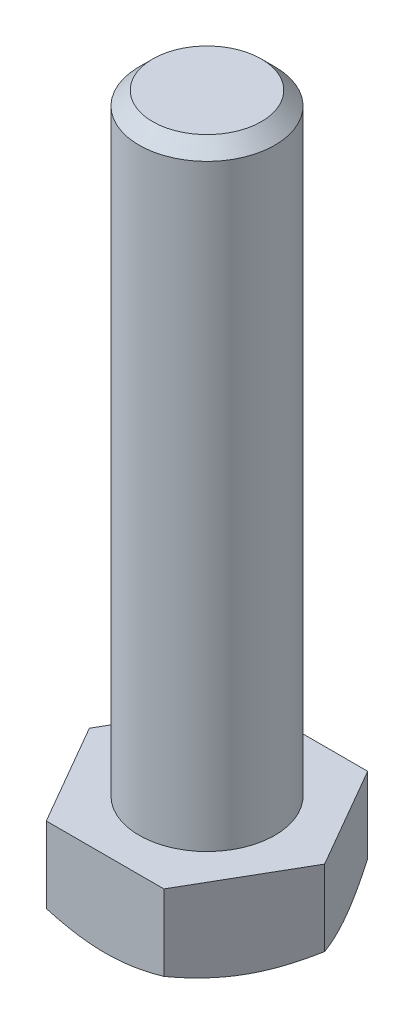
ISO-10303-21;
HEADER;
FILE_DESCRIPTION(('STEP AP214'),'2;1');
FILE_NAME('part.step','',(''),(''),'','','');
FILE_SCHEMA(('AUTOMOTIVE_DESIGN { 1 0 10303 214 1 1 1 1 }'));
ENDSEC;
DATA;
#1=APPLICATION_CONTEXT('core data for automotive mechanical design processes');
#2=APPLICATION_PROTOCOL_DEFINITION('international standard','automotive_design',2000,#1);
#3=PRODUCT_CONTEXT('',#1,'mechanical');
#4=PRODUCT('Part','Part','',(#3));
#5=PRODUCT_RELATED_PRODUCT_CATEGORY('part','',(#4));
#6=PRODUCT_DEFINITION_FORMATION('','',#4);
#7=PRODUCT_DEFINITION_CONTEXT('part definition',#1,'design');
#8=PRODUCT_DEFINITION('design','',#6,#7);
#9=PRODUCT_DEFINITION_SHAPE('','',#8);
#10=(LENGTH_UNIT() NAMED_UNIT(*) SI_UNIT(.MILLI.,.METRE.));
#11=(NAMED_UNIT(*) PLANE_ANGLE_UNIT() SI_UNIT($,.RADIAN.));
#12=(NAMED_UNIT(*) SI_UNIT($,.STERADIAN.) SOLID_ANGLE_UNIT());
#13=UNCERTAINTY_MEASURE_WITH_UNIT(LENGTH_MEASURE(1.E-05),#10,'distance_accuracy_value','');
#14=(GEOMETRIC_REPRESENTATION_CONTEXT(3) GLOBAL_UNCERTAINTY_ASSIGNED_CONTEXT((#13)) GLOBAL_UNIT_ASSIGNED_CONTEXT((#10,
#11,#12)) REPRESENTATION_CONTEXT('',''));
#15=CARTESIAN_POINT('',(0.,0.,0.));
#16=DIRECTION('',(0.,0.,1.));
#17=DIRECTION('',(1.,0.,0.));
#18=AXIS2_PLACEMENT_3D('',#15,#16,#17);
#19=CARTESIAN_POINT('',(-8.66025403784437,12.5,15.));
#20=DIRECTION('',(0.,0.,-1.));
#21=DIRECTION('',(-1.,0.,0.));
#22=AXIS2_PLACEMENT_3D('',#19,#20,#21);
#23=PLANE('',#22);
#24=CARTESIAN_POINT('',(-22.9682699623457,7.17790057965226,15.));
#25=CARTESIAN_POINT('',(-22.6389897831074,7.01873142404232,15.));
#26=CARTESIAN_POINT('',(-22.3093116021534,6.86038603901537,15.));
#27=CARTESIAN_POINT('',(-21.6490751536496,6.54553189598666,15.));
#28=CARTESIAN_POINT('',(-21.3185168764806,6.38902315816101,15.));
#29=CARTESIAN_POINT('',(-20.3252989549744,5.92249019185913,15.));
#30=CARTESIAN_POINT('',(-19.6612032697286,5.6155111060719,15.));
#31=CARTESIAN_POINT('',(-18.3246226043912,5.00989859467258,15.));
#32=CARTESIAN_POINT('',(-17.6521113636296,4.71132298088697,15.));
#33=CARTESIAN_POINT('',(-16.3015621477646,4.12699119584707,15.));
#34=CARTESIAN_POINT('',(-15.6235244629268,3.84123435637443,15.));
#35=CARTESIAN_POINT('',(-14.2524269634776,3.28256457383085,15.));
#36=CARTESIAN_POINT('',(-13.5592849190571,3.00985238384249,15.));
#37=CARTESIAN_POINT('',(-12.1648203164479,2.48578579805704,15.));
#38=CARTESIAN_POINT('',(-11.4634968579634,2.23443377846729,15.));
#39=CARTESIAN_POINT('',(-10.0530172161698,1.75984469264095,15.));
#40=CARTESIAN_POINT('',(-9.34388131081083,1.53654785403614,15.));
#41=CARTESIAN_POINT('',(-7.91545988349898,1.12531011422904,15.));
#42=CARTESIAN_POINT('',(-7.19617764885276,0.937358032225478,15.));
#43=CARTESIAN_POINT('',(-6.10950776052101,0.688818819828081,15.));
#44=CARTESIAN_POINT('',(-5.74591626101912,0.611524520059375,15.));
#45=CARTESIAN_POINT('',(-5.01631310495841,0.469286024803715,15.));
#46=CARTESIAN_POINT('',(-4.6503015012506,0.404341560532863,15.));
#47=CARTESIAN_POINT('',(-3.91609659669045,0.28795299776045,15.));
#48=CARTESIAN_POINT('',(-3.54790312013279,0.236510002059412,15.));
#49=CARTESIAN_POINT('',(-2.80977894214554,0.148161213469121,15.));
#50=CARTESIAN_POINT('',(-2.43984831081847,0.111254838973182,15.));
#51=CARTESIAN_POINT('',(-1.70111543119012,0.052969235151156,15.));
#52=CARTESIAN_POINT('',(-1.33232087528458,0.0314931455080723,15.));
#53=CARTESIAN_POINT('',(-0.594154033471562,0.00418216853330275,15.));
#54=CARTESIAN_POINT('',(-0.224781755128965,-0.00165292191907885,15.));
#55=CARTESIAN_POINT('',(0.513772761739808,0.0024565342659176,15.));
#56=CARTESIAN_POINT('',(0.882955024506809,0.0123966523921795,15.));
#57=CARTESIAN_POINT('',(1.62057875039964,0.0478095011464207,15.));
#58=CARTESIAN_POINT('',(1.98902017560895,0.0732830074530997,15.));
#59=CARTESIAN_POINT('',(2.88200878597982,0.153315988744048,15.));
#60=CARTESIAN_POINT('',(3.40586988037198,0.2156582294693,15.));
#61=CARTESIAN_POINT('',(4.44957771463115,0.368284321561829,15.));
#62=CARTESIAN_POINT('',(4.96942331940067,0.458575797224107,15.));
#63=CARTESIAN_POINT('',(6.00467140043033,0.663898119259721,15.));
#64=CARTESIAN_POINT('',(6.52006919294576,0.778952357645818,15.));
#65=CARTESIAN_POINT('',(7.54556200724787,1.03028935659401,15.));
#66=CARTESIAN_POINT('',(8.05565752365372,1.16657011774881,15.));
#67=CARTESIAN_POINT('',(9.08310964327576,1.46066370490329,15.));
#68=CARTESIAN_POINT('',(9.60033774272846,1.6189224444397,15.));
#69=CARTESIAN_POINT('',(10.6293258234342,1.95107200986665,15.));
#70=CARTESIAN_POINT('',(11.1410893076101,2.12495205365792,15.));
#71=CARTESIAN_POINT('',(12.1570993841288,2.48477464183466,15.));
#72=CARTESIAN_POINT('',(12.6613720729254,2.67064378150478,15.));
#73=CARTESIAN_POINT('',(13.4147912594166,2.95756327132976,15.));
#74=CARTESIAN_POINT('',(13.6654863245841,3.05457748949894,15.));
#75=CARTESIAN_POINT('',(14.1659013187592,3.25107322933562,15.));
#76=CARTESIAN_POINT('',(14.4156212703266,3.35055469352573,15.));
#77=CARTESIAN_POINT('',(14.6648887120004,3.45115877453162,15.));
#78=B_SPLINE_CURVE_WITH_KNOTS('',3,(#24,#25,#26,#27,#28,#29,#30,#31,#32,#33,#34,#35,#36,#37,#38,
#39,#40,#41,#42,#43,#44,#45,#46,#47,#48,#49,#50,#51,#52,#53,#54,#55,#56,#57,#58,#59,#60,#61,#62,
#63,#64,#65,#66,#67,#68,#69,#70,#71,#72,#73,#74,#75,#76,#77),.UNSPECIFIED.,.F.,.F.,(4,2,2,2,2,2,
2,2,2,2,2,2,2,2,2,2,2,2,2,2,2,2,2,2,2,2,4),(0.,1.09719534304745,2.19440272785255,
4.38917437060372,6.59650580508102,8.80372204153741,11.0380360432621,13.2725982762572,
15.502315932016,17.7313270580364,18.8463006788363,19.9612500303848,21.0762904227212,
22.1912861980293,23.2992201789375,24.4071397716721,25.5147483975893,26.6224123378252,
28.2042036031028,29.7864267473646,31.3701511423085,32.9537264503146,34.5761185954281,
36.1973994161361,37.8095545791832,38.6159794277519,39.4223855073193),.UNSPECIFIED.);
#79=CARTESIAN_POINT('',(8.66025403784439,1.33974596215562,15.));
#80=VERTEX_POINT('',#79);
#81=CARTESIAN_POINT('',(0.,0.,15.));
#82=VERTEX_POINT('',#81);
#83=EDGE_CURVE('E236',#80,#82,#78,.F.);
#84=ORIENTED_EDGE('',*,*,#83,.F.);
#85=DIRECTION('',(0.,-1.,0.));
#86=VECTOR('',#85,1.);
#87=CARTESIAN_POINT('',(8.66025403784439,12.5,15.));
#88=LINE('',#87,#86);
#89=CARTESIAN_POINT('',(8.66025403784439,12.5,15.));
#90=VERTEX_POINT('',#89);
#91=EDGE_CURVE('E135',#90,#80,#88,.T.);
#92=ORIENTED_EDGE('',*,*,#91,.F.);
#93=DIRECTION('',(1.,0.,0.));
#94=VECTOR('',#93,1.);
#95=CARTESIAN_POINT('',(-8.66025403784437,12.5,15.));
#96=LINE('',#95,#94);
#97=CARTESIAN_POINT('',(-8.66025403784437,12.5,15.));
#98=VERTEX_POINT('',#97);
#99=EDGE_CURVE('E246',#98,#90,#96,.T.);
#100=ORIENTED_EDGE('',*,*,#99,.F.);
#101=DIRECTION('',(0.,-1.,0.));
#102=VECTOR('',#101,1.);
#103=CARTESIAN_POINT('',(-8.66025403784437,12.5,15.));
#104=LINE('',#103,#102);
#105=CARTESIAN_POINT('',(-8.66025403784439,1.33974596215562,15.));
#106=VERTEX_POINT('',#105);
#107=EDGE_CURVE('E261',#98,#106,#104,.T.);
#108=ORIENTED_EDGE('',*,*,#107,.T.);
#109=EDGE_CURVE('E200',#82,#106,#78,.F.);
#110=ORIENTED_EDGE('',*,*,#109,.F.);
#111=EDGE_LOOP('',(#84,#92,#100,#108,#110));
#112=FACE_BOUND('',#111,.T.);
#113=ADVANCED_FACE('F38',(#112),#23,.F.);
#114=CARTESIAN_POINT('',(8.66025403784439,12.5,15.));
#115=DIRECTION('',(-0.866025403784438,0.,-0.5));
#116=DIRECTION('',(-0.500000000000001,0.,0.866025403784439));
#117=AXIS2_PLACEMENT_3D('',#114,#115,#116);
#118=PLANE('',#117);
#119=CARTESIAN_POINT('',(17.3206235457426,1.33981262948895,-0.000200000000002282));
#120=CARTESIAN_POINT('',(17.130274565913,1.22992178974395,0.329494104233802));
#121=CARTESIAN_POINT('',(16.939183122782,1.12501758932862,0.660474192628304));
#122=CARTESIAN_POINT('',(16.5554679079492,0.926568581943116,1.32508844035602));
#123=CARTESIAN_POINT('',(16.3628436543362,0.833027511049506,1.65872343438381));
#124=CARTESIAN_POINT('',(15.9756905506624,0.658562147609872,2.32929228025473));
#125=CARTESIAN_POINT('',(15.7811583127512,0.577667706602199,2.66623200002702));
#126=CARTESIAN_POINT('',(15.3907420734253,0.430232643422054,3.34245276263939));
#127=CARTESIAN_POINT('',(15.1948581497855,0.363691202381336,3.68173367076952));
#128=CARTESIAN_POINT('',(14.8067578304067,0.247792374696317,4.35394314236733));
#129=CARTESIAN_POINT('',(14.6145702475688,0.198051383436675,4.68682180042635));
#130=CARTESIAN_POINT('',(14.2293144416656,0.114646749003616,5.35410443016171));
#131=CARTESIAN_POINT('',(14.0362462017216,0.0809834152900945,5.68850843107251));
#132=CARTESIAN_POINT('',(13.6497853945793,0.0305840757080928,6.35787818417717));
#133=CARTESIAN_POINT('',(13.4563934876199,0.0138279549580595,6.69284279280337));
#134=CARTESIAN_POINT('',(13.0694311550724,-0.00239660617301752,7.36308121339102));
#135=CARTESIAN_POINT('',(12.8758607351851,-0.00186558072758015,7.69835501547826));
#136=CARTESIAN_POINT('',(12.5139822792559,0.0152766129981689,8.32514688731221));
#137=CARTESIAN_POINT('',(12.3456484541475,0.0297968460490207,8.61670962503244));
#138=CARTESIAN_POINT('',(12.0093680110861,0.071637140422421,9.1991644380065));
#139=CARTESIAN_POINT('',(11.8414214213658,0.0989581071094842,9.4900564643599));
#140=CARTESIAN_POINT('',(11.5060066717823,0.165923511998912,10.0710118522466));
#141=CARTESIAN_POINT('',(11.338539022767,0.205578128270671,10.3610743289652));
#142=CARTESIAN_POINT('',(11.0043888432043,0.296515103017914,10.939839417326));
#143=CARTESIAN_POINT('',(10.8377063668174,0.347798251969268,11.2285419351595));
#144=CARTESIAN_POINT('',(10.3317324659531,0.520386864747118,12.1049144387604));
#145=CARTESIAN_POINT('',(9.99390625559026,0.658901178256943,12.6900465992373));
#146=CARTESIAN_POINT('',(9.32329122184511,0.973271968475227,13.8515859100034));
#147=CARTESIAN_POINT('',(8.99049381241396,1.14905461461789,14.4280079317654));
#148=CARTESIAN_POINT('',(8.66013856779054,1.33981262948895,15.0002));
#149=B_SPLINE_CURVE_WITH_KNOTS('',3,(#119,#120,#121,#122,#123,#124,#125,#126,#127,#128,#129,
#130,#131,#132,#133,#134,#135,#136,#137,#138,#139,#140,#141,#142,#143,#144,#145,#146,#147,#148),
.UNSPECIFIED.,.F.,.F.,(4,2,2,2,2,2,2,2,2,2,2,2,2,2,4),(0.,1.18875411504163,2.37789802800057,
3.56980778300395,4.76164951910136,5.92407379683759,7.08652044780813,8.24758247406079,
9.40860862348378,10.4193068498566,11.4300765712312,12.4416826308653,13.4533574773408,
15.5211962051185,17.5849760846241),.UNSPECIFIED.);
#150=CARTESIAN_POINT('',(17.3205080756888,1.33974596215562,0.));
#151=VERTEX_POINT('',#150);
#152=CARTESIAN_POINT('',(12.9903810567666,0.,7.5));
#153=VERTEX_POINT('',#152);
#154=EDGE_CURVE('E54',#151,#153,#149,.T.);
#155=ORIENTED_EDGE('',*,*,#154,.F.);
#156=DIRECTION('',(0.,-1.,0.));
#157=VECTOR('',#156,1.);
#158=CARTESIAN_POINT('',(17.3205080756888,12.4999999999999,0.));
#159=LINE('',#158,#157);
#160=CARTESIAN_POINT('',(17.3205080756888,12.4999999999999,0.));
#161=VERTEX_POINT('',#160);
#162=EDGE_CURVE('E132',#161,#151,#159,.T.);
#163=ORIENTED_EDGE('',*,*,#162,.F.);
#164=DIRECTION('',(0.5,0.,-0.866025403784438));
#165=VECTOR('',#164,1.);
#166=CARTESIAN_POINT('',(8.66025403784439,12.5,15.));
#167=LINE('',#166,#165);
#168=EDGE_CURVE('E242',#90,#161,#167,.T.);
#169=ORIENTED_EDGE('',*,*,#168,.F.);
#170=ORIENTED_EDGE('',*,*,#91,.T.);
#171=EDGE_CURVE('E211',#153,#80,#149,.T.);
#172=ORIENTED_EDGE('',*,*,#171,.F.);
#173=EDGE_LOOP('',(#155,#163,#169,#170,#172));
#174=FACE_BOUND('',#173,.T.);
#175=ADVANCED_FACE('F223',(#174),#118,.F.);
#176=CARTESIAN_POINT('',(17.3205080756888,12.4999999999999,0.));
#177=DIRECTION('',(-0.866025403784438,0.,0.5));
#178=DIRECTION('',(0.5,0.,0.866025403784438));
#179=AXIS2_PLACEMENT_3D('',#176,#177,#178);
#180=PLANE('',#179);
#181=CARTESIAN_POINT('',(8.66013856779054,1.33981262948888,-15.0002));
#182=CARTESIAN_POINT('',(8.85048754762015,1.22992178974392,-14.6705058957662));
#183=CARTESIAN_POINT('',(9.04157899075113,1.12501758932861,-14.3395258073717));
#184=CARTESIAN_POINT('',(9.42529420558398,0.926568581943117,-13.674911559644));
#185=CARTESIAN_POINT('',(9.617918459197,0.833027511049501,-13.3412765656162));
#186=CARTESIAN_POINT('',(10.0050715628708,0.658562147609863,-12.6707077197453));
#187=CARTESIAN_POINT('',(10.199603800782,0.577667706602192,-12.333767999973));
#188=CARTESIAN_POINT('',(10.5900200401078,0.430232643422048,-11.6575472373606));
#189=CARTESIAN_POINT('',(10.7859039637477,0.36369120238133,-11.3182663292305));
#190=CARTESIAN_POINT('',(11.1740042831265,0.247792374696312,-10.6460568576327));
#191=CARTESIAN_POINT('',(11.3661918659643,0.198051383436669,-10.3131781995737));
#192=CARTESIAN_POINT('',(11.7514476718676,0.114646749003609,-9.64589556983832));
#193=CARTESIAN_POINT('',(11.9445159118115,0.0809834152900877,-9.31149156892752));
#194=CARTESIAN_POINT('',(12.3309767189539,0.0305840757080838,-8.64212181582286));
#195=CARTESIAN_POINT('',(12.5243686259132,0.0138279549580488,-8.30715720719666));
#196=CARTESIAN_POINT('',(12.9113309584608,-0.00239660617302286,-7.63691878660901));
#197=CARTESIAN_POINT('',(13.104901378348,-0.00186558072757864,-7.30164498452176));
#198=CARTESIAN_POINT('',(13.4667798342773,0.0152766129981676,-6.6748531126878));
#199=CARTESIAN_POINT('',(13.6351136593857,0.0297968460490117,-6.38329037496758));
#200=CARTESIAN_POINT('',(13.9713941024471,0.0716371404224077,-5.80083556199353));
#201=CARTESIAN_POINT('',(14.1393406921673,0.0989581071094743,-5.50994353564012));
#202=CARTESIAN_POINT('',(14.4747554417509,0.165923511998904,-4.92898814775339));
#203=CARTESIAN_POINT('',(14.6422230907662,0.205578128270661,-4.63892567103482));
#204=CARTESIAN_POINT('',(14.9763732703288,0.296515103017903,-4.06016058267397));
#205=CARTESIAN_POINT('',(15.1430557467157,0.347798251969258,-3.77145806484048));
#206=CARTESIAN_POINT('',(15.6490296475801,0.520386864747109,-2.8950855612396));
#207=CARTESIAN_POINT('',(15.9868558579429,0.658901178256931,-2.30995340076275));
#208=CARTESIAN_POINT('',(16.657470891688,0.973271968475215,-1.14841408999665));
#209=CARTESIAN_POINT('',(16.9902683011192,1.14905461461788,-0.571992068234597));
#210=CARTESIAN_POINT('',(17.3206235457426,1.33981262948895,0.000199999999981465));
#211=B_SPLINE_CURVE_WITH_KNOTS('',3,(#181,#182,#183,#184,#185,#186,#187,#188,#189,#190,#191,
#192,#193,#194,#195,#196,#197,#198,#199,#200,#201,#202,#203,#204,#205,#206,#207,#208,#209,#210),
.UNSPECIFIED.,.F.,.F.,(4,2,2,2,2,2,2,2,2,2,2,2,2,2,4),(0.,1.18875411504163,2.37789802800057,
3.56980778300394,4.76164951910135,5.92407379683758,7.08652044780811,8.24758247406078,
9.40860862348376,10.4193068498566,11.4300765712312,12.4416826308653,13.4533574773408,
15.5211962051185,17.5849760846241),.UNSPECIFIED.);
#212=CARTESIAN_POINT('',(8.66025403784438,1.33974596215555,-15.));
#213=VERTEX_POINT('',#212);
#214=CARTESIAN_POINT('',(12.9903810567666,0.,-7.50000000000001));
#215=VERTEX_POINT('',#214);
#216=EDGE_CURVE('E61',#213,#215,#211,.T.);
#217=ORIENTED_EDGE('',*,*,#216,.F.);
#218=DIRECTION('',(0.,-1.,0.));
#219=VECTOR('',#218,1.);
#220=CARTESIAN_POINT('',(8.66025403784438,12.4999999999999,-15.));
#221=LINE('',#220,#219);
#222=CARTESIAN_POINT('',(8.66025403784438,12.4999999999999,-15.));
#223=VERTEX_POINT('',#222);
#224=EDGE_CURVE('E124',#223,#213,#221,.T.);
#225=ORIENTED_EDGE('',*,*,#224,.F.);
#226=DIRECTION('',(-0.5,0.,-0.866025403784438));
#227=VECTOR('',#226,1.);
#228=CARTESIAN_POINT('',(17.3205080756888,12.4999999999999,0.));
#229=LINE('',#228,#227);
#230=EDGE_CURVE('E245',#161,#223,#229,.T.);
#231=ORIENTED_EDGE('',*,*,#230,.F.);
#232=ORIENTED_EDGE('',*,*,#162,.T.);
#233=EDGE_CURVE('E116',#215,#151,#211,.T.);
#234=ORIENTED_EDGE('',*,*,#233,.F.);
#235=EDGE_LOOP('',(#217,#225,#231,#232,#234));
#236=FACE_BOUND('',#235,.T.);
#237=ADVANCED_FACE('F122',(#236),#180,.F.);
#238=CARTESIAN_POINT('',(8.66025403784438,12.4999999999999,-15.));
#239=DIRECTION('',(0.,0.,1.));
#240=DIRECTION('',(1.,0.,0.));
#241=AXIS2_PLACEMENT_3D('',#238,#239,#240);
#242=PLANE('',#241);
#243=CARTESIAN_POINT('',(-22.9682699623457,7.1779005796522,-15.));
#244=CARTESIAN_POINT('',(-22.6389897831074,7.0187314240423,-15.));
#245=CARTESIAN_POINT('',(-22.3093116021533,6.86038603901537,-15.));
#246=CARTESIAN_POINT('',(-21.6490751536496,6.54553189598667,-15.));
#247=CARTESIAN_POINT('',(-21.3185168764806,6.38902315816101,-15.));
#248=CARTESIAN_POINT('',(-20.3252989549744,5.92249019185913,-15.));
#249=CARTESIAN_POINT('',(-19.6612032697286,5.61551110607191,-15.));
#250=CARTESIAN_POINT('',(-18.3246226043912,5.00989859467259,-15.));
#251=CARTESIAN_POINT('',(-17.6521113636296,4.71132298088698,-15.));
#252=CARTESIAN_POINT('',(-16.3015621477646,4.12699119584708,-15.));
#253=CARTESIAN_POINT('',(-15.6235244629267,3.84123435637444,-15.));
#254=CARTESIAN_POINT('',(-14.2524269634776,3.28256457383085,-15.));
#255=CARTESIAN_POINT('',(-13.5592849190571,3.0098523838425,-15.));
#256=CARTESIAN_POINT('',(-12.1648203164479,2.48578579805705,-15.));
#257=CARTESIAN_POINT('',(-11.4634968579634,2.23443377846729,-15.));
#258=CARTESIAN_POINT('',(-10.0530172161698,1.75984469264097,-15.));
#259=CARTESIAN_POINT('',(-9.3438813108108,1.53654785403618,-15.0000000000001));
#260=CARTESIAN_POINT('',(-7.91545988349897,1.12531011422903,-15.));
#261=CARTESIAN_POINT('',(-7.19617764885277,0.937358032225381,-15.));
#262=CARTESIAN_POINT('',(-6.10950776052102,0.688818819828036,-15.));
#263=CARTESIAN_POINT('',(-5.74591626101912,0.611524520059377,-15.));
#264=CARTESIAN_POINT('',(-5.01631310495841,0.46928602480375,-15.));
#265=CARTESIAN_POINT('',(-4.6503015012506,0.404341560532887,-15.));
#266=CARTESIAN_POINT('',(-3.91609659669045,0.287952997760466,-15.));
#267=CARTESIAN_POINT('',(-3.54790312013279,0.236510002059431,-15.));
#268=CARTESIAN_POINT('',(-2.80977894214554,0.148161213469143,-15.));
#269=CARTESIAN_POINT('',(-2.43984831081847,0.111254838973203,-15.));
#270=CARTESIAN_POINT('',(-1.70111543119013,0.0529692351511771,-15.));
#271=CARTESIAN_POINT('',(-1.33232087528458,0.0314931455080947,-15.));
#272=CARTESIAN_POINT('',(-0.594154033471562,0.00418216853332259,-15.));
#273=CARTESIAN_POINT('',(-0.224781755128966,-0.00165292191906309,-15.));
#274=CARTESIAN_POINT('',(0.513772761739804,0.00245653426594426,-15.));
#275=CARTESIAN_POINT('',(0.882955024506803,0.0123966523922211,-15.0000000000001));
#276=CARTESIAN_POINT('',(1.62057875039963,0.0478095011464235,-15.));
#277=CARTESIAN_POINT('',(1.98902017560894,0.0732830074530487,-15.));
#278=CARTESIAN_POINT('',(2.88200878597982,0.153315988743969,-15.));
#279=CARTESIAN_POINT('',(3.40586988037197,0.215658229469292,-15.));
#280=CARTESIAN_POINT('',(4.44957771463112,0.368284321561873,-15.0000000000001));
#281=CARTESIAN_POINT('',(4.96942331940065,0.458575797224132,-15.));
#282=CARTESIAN_POINT('',(6.00467140043031,0.663898119259731,-15.));
#283=CARTESIAN_POINT('',(6.52006919294575,0.778952357645833,-15.));
#284=CARTESIAN_POINT('',(7.54556200724786,1.03028935659403,-15.));
#285=CARTESIAN_POINT('',(8.05565752365371,1.16657011774883,-15.));
#286=CARTESIAN_POINT('',(9.08310964327575,1.4606637049033,-15.));
#287=CARTESIAN_POINT('',(9.60033774272844,1.61892244443971,-15.));
#288=CARTESIAN_POINT('',(10.6293258234342,1.95107200986666,-15.));
#289=CARTESIAN_POINT('',(11.1410893076101,2.12495205365794,-15.));
#290=CARTESIAN_POINT('',(12.1570993841288,2.48477464183468,-15.));
#291=CARTESIAN_POINT('',(12.6613720729254,2.67064378150479,-15.));
#292=CARTESIAN_POINT('',(13.4147912594165,2.95756327132977,-15.));
#293=CARTESIAN_POINT('',(13.6654863245841,3.05457748949895,-15.0000000000001));
#294=CARTESIAN_POINT('',(14.1659013187592,3.25107322933563,-15.));
#295=CARTESIAN_POINT('',(14.4156212703266,3.35055469352573,-15.));
#296=CARTESIAN_POINT('',(14.6648887120004,3.45115877453161,-15.));
#297=B_SPLINE_CURVE_WITH_KNOTS('',3,(#243,#244,#245,#246,#247,#248,#249,#250,#251,#252,#253,
#254,#255,#256,#257,#258,#259,#260,#261,#262,#263,#264,#265,#266,#267,#268,#269,#270,#271,#272,
#273,#274,#275,#276,#277,#278,#279,#280,#281,#282,#283,#284,#285,#286,#287,#288,#289,#290,#291,
#292,#293,#294,#295,#296),.UNSPECIFIED.,.F.,.F.,(4,2,2,2,2,2,2,2,2,2,2,2,2,2,2,2,2,2,2,2,2,2,2,
2,2,2,4),(0.,1.09719534304744,2.19440272785254,4.38917437060371,6.596505805081,8.80372204153741,
11.0380360432621,13.2725982762572,15.502315932016,17.7313270580364,18.8463006788363,
19.9612500303848,21.0762904227212,22.1912861980293,23.2992201789375,24.4071397716721,
25.5147483975893,26.6224123378252,28.2042036031028,29.7864267473645,31.3701511423084,
32.9537264503146,34.5761185954281,36.1973994161361,37.8095545791832,38.6159794277519,
39.4223855073193),.UNSPECIFIED.);
#298=CARTESIAN_POINT('',(-8.66025403784439,1.33974596215555,-15.));
#299=VERTEX_POINT('',#298);
#300=CARTESIAN_POINT('',(0.,0.,-15.));
#301=VERTEX_POINT('',#300);
#302=EDGE_CURVE('E118',#299,#301,#297,.T.);
#303=ORIENTED_EDGE('',*,*,#302,.F.);
#304=DIRECTION('',(0.,-1.,0.));
#305=VECTOR('',#304,1.);
#306=CARTESIAN_POINT('',(-8.66025403784439,12.4999999999999,-15.));
#307=LINE('',#306,#305);
#308=CARTESIAN_POINT('',(-8.66025403784439,12.4999999999999,-15.));
#309=VERTEX_POINT('',#308);
#310=EDGE_CURVE('E133',#309,#299,#307,.T.);
#311=ORIENTED_EDGE('',*,*,#310,.F.);
#312=DIRECTION('',(-1.,0.,0.));
#313=VECTOR('',#312,1.);
#314=CARTESIAN_POINT('',(8.66025403784438,12.4999999999999,-15.));
#315=LINE('',#314,#313);
#316=EDGE_CURVE('E131',#223,#309,#315,.T.);
#317=ORIENTED_EDGE('',*,*,#316,.F.);
#318=ORIENTED_EDGE('',*,*,#224,.T.);
#319=EDGE_CURVE('E108',#301,#213,#297,.T.);
#320=ORIENTED_EDGE('',*,*,#319,.F.);
#321=EDGE_LOOP('',(#303,#311,#317,#318,#320));
#322=FACE_BOUND('',#321,.T.);
#323=ADVANCED_FACE('F129',(#322),#242,.F.);
#324=CARTESIAN_POINT('',(-8.66025403784439,12.4999999999999,-15.));
#325=DIRECTION('',(0.866025403784439,0.,0.5));
#326=DIRECTION('',(0.5,0.,-0.866025403784439));
#327=AXIS2_PLACEMENT_3D('',#324,#325,#326);
#328=PLANE('',#327);
#329=CARTESIAN_POINT('',(-17.3206235457426,1.33981262948888,0.000199999999995343));
#330=CARTESIAN_POINT('',(-17.130274565913,1.22992178974392,-0.329494104233815));
#331=CARTESIAN_POINT('',(-16.939183122782,1.12501758932861,-0.660474192628318));
#332=CARTESIAN_POINT('',(-16.5554679079492,0.926568581943116,-1.32508844035604));
#333=CARTESIAN_POINT('',(-16.3628436543361,0.833027511049501,-1.65872343438382));
#334=CARTESIAN_POINT('',(-15.9756905506624,0.658562147609864,-2.32929228025474));
#335=CARTESIAN_POINT('',(-15.7811583127512,0.577667706602193,-2.66623200002703));
#336=CARTESIAN_POINT('',(-15.3907420734253,0.430232643422049,-3.3424527626394));
#337=CARTESIAN_POINT('',(-15.1948581497855,0.363691202381331,-3.68173367076953));
#338=CARTESIAN_POINT('',(-14.8067578304067,0.247792374696313,-4.35394314236734));
#339=CARTESIAN_POINT('',(-14.6145702475688,0.198051383436671,-4.68682180042636));
#340=CARTESIAN_POINT('',(-14.2293144416655,0.114646749003609,-5.35410443016172));
#341=CARTESIAN_POINT('',(-14.0362462017216,0.0809834152900845,-5.68850843107252));
#342=CARTESIAN_POINT('',(-13.6497853945792,0.0305840757080935,-6.35787818417718));
#343=CARTESIAN_POINT('',(-13.4563934876199,0.0138279549580744,-6.69284279280337));
#344=CARTESIAN_POINT('',(-13.0694311550724,-0.00239660617303949,-7.36308121339103));
#345=CARTESIAN_POINT('',(-12.8758607351851,-0.00186558072765343,-7.69835501547827));
#346=CARTESIAN_POINT('',(-12.5139822792559,0.0152766129981029,-8.32514688731222));
#347=CARTESIAN_POINT('',(-12.3456484541475,0.0297968460489999,-8.61670962503244));
#348=CARTESIAN_POINT('',(-12.0093680110861,0.0716371404224336,-9.19916443800649));
#349=CARTESIAN_POINT('',(-11.8414214213658,0.098958107109485,-9.4900564643599));
#350=CARTESIAN_POINT('',(-11.5060066717823,0.165923511998904,-10.0710118522466));
#351=CARTESIAN_POINT('',(-11.338539022767,0.205578128270666,-10.3610743289652));
#352=CARTESIAN_POINT('',(-11.0043888432043,0.296515103017912,-10.939839417326));
#353=CARTESIAN_POINT('',(-10.8377063668174,0.347798251969266,-11.2285419351595));
#354=CARTESIAN_POINT('',(-10.3317324659531,0.520386864747117,-12.1049144387604));
#355=CARTESIAN_POINT('',(-9.99390625559024,0.658901178256946,-12.6900465992373));
#356=CARTESIAN_POINT('',(-9.3232912218451,0.973271968475218,-13.8515859100034));
#357=CARTESIAN_POINT('',(-8.99049381241395,1.14905461461786,-14.4280079317654));
#358=CARTESIAN_POINT('',(-8.66013856779055,1.33981262948888,-15.0002));
#359=B_SPLINE_CURVE_WITH_KNOTS('',3,(#329,#330,#331,#332,#333,#334,#335,#336,#337,#338,#339,
#340,#341,#342,#343,#344,#345,#346,#347,#348,#349,#350,#351,#352,#353,#354,#355,#356,#357,#358),
.UNSPECIFIED.,.F.,.F.,(4,2,2,2,2,2,2,2,2,2,2,2,2,2,4),(0.,1.18875411504162,2.37789802800056,
3.56980778300394,4.76164951910136,5.92407379683758,7.08652044780812,8.24758247406078,
9.40860862348376,10.4193068498566,11.4300765712312,12.4416826308653,13.4533574773408,
15.5211962051185,17.5849760846241),.UNSPECIFIED.);
#360=CARTESIAN_POINT('',(-17.3205080756888,1.33974596215555,0.));
#361=VERTEX_POINT('',#360);
#362=CARTESIAN_POINT('',(-12.9903810567666,0.,-7.50000000000001));
#363=VERTEX_POINT('',#362);
#364=EDGE_CURVE('E178',#361,#363,#359,.T.);
#365=ORIENTED_EDGE('',*,*,#364,.F.);
#366=DIRECTION('',(0.,-1.,0.));
#367=VECTOR('',#366,1.);
#368=CARTESIAN_POINT('',(-17.3205080756888,12.5,0.));
#369=LINE('',#368,#367);
#370=CARTESIAN_POINT('',(-17.3205080756888,12.5,0.));
#371=VERTEX_POINT('',#370);
#372=EDGE_CURVE('E138',#371,#361,#369,.T.);
#373=ORIENTED_EDGE('',*,*,#372,.F.);
#374=DIRECTION('',(-0.5,0.,0.866025403784439));
#375=VECTOR('',#374,1.);
#376=CARTESIAN_POINT('',(-8.66025403784439,12.4999999999999,-15.));
#377=LINE('',#376,#375);
#378=EDGE_CURVE('E258',#309,#371,#377,.T.);
#379=ORIENTED_EDGE('',*,*,#378,.F.);
#380=ORIENTED_EDGE('',*,*,#310,.T.);
#381=EDGE_CURVE('E240',#363,#299,#359,.T.);
#382=ORIENTED_EDGE('',*,*,#381,.F.);
#383=EDGE_LOOP('',(#365,#373,#379,#380,#382));
#384=FACE_BOUND('',#383,.T.);
#385=ADVANCED_FACE('F269',(#384),#328,.F.);
#386=CARTESIAN_POINT('',(-17.3205080756888,12.5,0.));
#387=DIRECTION('',(0.866025403784439,0.,-0.5));
#388=DIRECTION('',(-0.5,0.,-0.866025403784439));
#389=AXIS2_PLACEMENT_3D('',#386,#387,#388);
#390=PLANE('',#389);
#391=CARTESIAN_POINT('',(-8.66013856779055,1.33981262948894,15.0002));
#392=CARTESIAN_POINT('',(-8.85048754762016,1.22992178974394,14.6705058957662));
#393=CARTESIAN_POINT('',(-9.04157899075113,1.12501758932861,14.3395258073717));
#394=CARTESIAN_POINT('',(-9.42529420558399,0.926568581943105,13.674911559644));
#395=CARTESIAN_POINT('',(-9.61791845919701,0.833027511049495,13.3412765656162));
#396=CARTESIAN_POINT('',(-10.0050715628708,0.658562147609862,12.6707077197453));
#397=CARTESIAN_POINT('',(-10.199603800782,0.57766770660219,12.333767999973));
#398=CARTESIAN_POINT('',(-10.5900200401078,0.430232643422046,11.6575472373606));
#399=CARTESIAN_POINT('',(-10.7859039637477,0.363691202381328,11.3182663292305));
#400=CARTESIAN_POINT('',(-11.1740042831265,0.24779237469631,10.6460568576327));
#401=CARTESIAN_POINT('',(-11.3661918659643,0.198051383436667,10.3131781995737));
#402=CARTESIAN_POINT('',(-11.7514476718676,0.114646749003608,9.6458955698383));
#403=CARTESIAN_POINT('',(-11.9445159118115,0.0809834152900867,9.3114915689275));
#404=CARTESIAN_POINT('',(-12.3309767189539,0.0305840757080837,8.64212181582284));
#405=CARTESIAN_POINT('',(-12.5243686259132,0.0138279549580489,8.30715720719664));
#406=CARTESIAN_POINT('',(-12.9113309584608,-0.00239660617302298,7.63691878660899));
#407=CARTESIAN_POINT('',(-13.1049013783481,-0.00186558072757921,7.30164498452175));
#408=CARTESIAN_POINT('',(-13.4667798342773,0.0152766129981681,6.67485311268779));
#409=CARTESIAN_POINT('',(-13.6351136593857,0.0297968460490136,6.38329037496757));
#410=CARTESIAN_POINT('',(-13.9713941024471,0.0716371404224097,5.80083556199351));
#411=CARTESIAN_POINT('',(-14.1393406921673,0.0989581071094749,5.50994353564011));
#412=CARTESIAN_POINT('',(-14.4747554417509,0.165923511998904,4.92898814775337));
#413=CARTESIAN_POINT('',(-14.6422230907662,0.205578128270662,4.63892567103481));
#414=CARTESIAN_POINT('',(-14.9763732703288,0.296515103017905,4.06016058267396));
#415=CARTESIAN_POINT('',(-15.1430557467157,0.347798251969259,3.77145806484047));
#416=CARTESIAN_POINT('',(-15.6490296475801,0.520386864747112,2.89508556123959));
#417=CARTESIAN_POINT('',(-15.9868558579429,0.658901178256939,2.30995340076275));
#418=CARTESIAN_POINT('',(-16.657470891688,0.973271968475209,1.14841408999664));
#419=CARTESIAN_POINT('',(-16.9902683011192,1.14905461461785,0.571992068234584));
#420=CARTESIAN_POINT('',(-17.3206235457426,1.33981262948887,-0.000200000000009221));
#421=B_SPLINE_CURVE_WITH_KNOTS('',3,(#391,#392,#393,#394,#395,#396,#397,#398,#399,#400,#401,
#402,#403,#404,#405,#406,#407,#408,#409,#410,#411,#412,#413,#414,#415,#416,#417,#418,#419,#420),
.UNSPECIFIED.,.F.,.F.,(4,2,2,2,2,2,2,2,2,2,2,2,2,2,4),(0.,1.18875411504163,2.37789802800057,
3.56980778300394,4.76164951910135,5.92407379683758,7.08652044780811,8.24758247406078,
9.40860862348376,10.4193068498566,11.4300765712312,12.4416826308653,13.4533574773408,
15.5211962051185,17.5849760846241),.UNSPECIFIED.);
#422=CARTESIAN_POINT('',(-12.9903810567666,0.,7.5));
#423=VERTEX_POINT('',#422);
#424=EDGE_CURVE('E169',#106,#423,#421,.T.);
#425=ORIENTED_EDGE('',*,*,#424,.F.);
#426=ORIENTED_EDGE('',*,*,#107,.F.);
#427=DIRECTION('',(0.5,0.,0.866025403784439));
#428=VECTOR('',#427,1.);
#429=CARTESIAN_POINT('',(-17.3205080756888,12.5,0.));
#430=LINE('',#429,#428);
#431=EDGE_CURVE('E251',#371,#98,#430,.T.);
#432=ORIENTED_EDGE('',*,*,#431,.F.);
#433=ORIENTED_EDGE('',*,*,#372,.T.);
#434=EDGE_CURVE('E167',#423,#361,#421,.T.);
#435=ORIENTED_EDGE('',*,*,#434,.F.);
#436=EDGE_LOOP('',(#425,#426,#432,#433,#435));
#437=FACE_BOUND('',#436,.T.);
#438=ADVANCED_FACE('F185',(#437),#390,.F.);
#439=CARTESIAN_POINT('',(0.,12.5,0.));
#440=DIRECTION('',(0.,1.,0.));
#441=DIRECTION('',(0.,0.,1.));
#442=AXIS2_PLACEMENT_3D('',#439,#440,#441);
#443=PLANE('',#442);
#444=ORIENTED_EDGE('',*,*,#99,.T.);
#445=ORIENTED_EDGE('',*,*,#168,.T.);
#446=ORIENTED_EDGE('',*,*,#230,.T.);
#447=ORIENTED_EDGE('',*,*,#316,.T.);
#448=ORIENTED_EDGE('',*,*,#378,.T.);
#449=ORIENTED_EDGE('',*,*,#431,.T.);
#450=EDGE_LOOP('',(#444,#445,#446,#447,#448,#449));
#451=FACE_BOUND('',#450,.T.);
#452=CARTESIAN_POINT('',(0.,12.5,0.));
#453=DIRECTION('',(0.,1.,0.));
#454=DIRECTION('',(0.,0.,1.));
#455=AXIS2_PLACEMENT_3D('',#452,#453,#454);
#456=CIRCLE('',#455,10.);
#457=CARTESIAN_POINT('',(0.,12.5,-10.));
#458=VERTEX_POINT('',#457);
#459=EDGE_CURVE('E127',#458,#458,#456,.T.);
#460=ORIENTED_EDGE('',*,*,#459,.F.);
#461=EDGE_LOOP('',(#460));
#462=FACE_BOUND('',#461,.T.);
#463=ADVANCED_FACE('F248',(#451,#462),#443,.T.);
#464=CARTESIAN_POINT('',(0.,102.5,0.));
#465=DIRECTION('',(0.,-1.,0.));
#466=DIRECTION('',(0.,0.,-1.));
#467=AXIS2_PLACEMENT_3D('',#464,#465,#466);
#468=CYLINDRICAL_SURFACE('',#467,10.);
#469=CARTESIAN_POINT('',(0.,100.5,0.));
#470=DIRECTION('',(0.,1.,0.));
#471=DIRECTION('',(0.,0.,1.));
#472=AXIS2_PLACEMENT_3D('',#469,#470,#471);
#473=CIRCLE('',#472,10.);
#474=CARTESIAN_POINT('',(0.,100.5,-10.));
#475=VERTEX_POINT('',#474);
#476=EDGE_CURVE('E146',#475,#475,#473,.F.);
#477=CARTESIAN_POINT('',(0.,100.5,-10.));
#478=CARTESIAN_POINT('',(0.,99.5833333333334,-10.));
#479=CARTESIAN_POINT('',(0.,98.6666666666667,-10.));
#480=CARTESIAN_POINT('',(0.,96.8333333333334,-10.));
#481=CARTESIAN_POINT('',(0.,95.9166666666667,-10.));
#482=CARTESIAN_POINT('',(0.,94.0833333333334,-10.));
#483=CARTESIAN_POINT('',(0.,93.1666666666667,-10.));
#484=CARTESIAN_POINT('',(0.,91.3333333333334,-10.));
#485=CARTESIAN_POINT('',(0.,90.4166666666667,-10.));
#486=CARTESIAN_POINT('',(0.,88.5833333333334,-10.));
#487=CARTESIAN_POINT('',(0.,87.6666666666667,-10.));
#488=CARTESIAN_POINT('',(0.,85.8333333333334,-10.));
#489=CARTESIAN_POINT('',(0.,84.9166666666667,-10.));
#490=CARTESIAN_POINT('',(0.,83.0833333333334,-10.));
#491=CARTESIAN_POINT('',(0.,82.1666666666667,-10.));
#492=CARTESIAN_POINT('',(0.,80.3333333333334,-10.));
#493=CARTESIAN_POINT('',(0.,79.4166666666667,-10.));
#494=CARTESIAN_POINT('',(0.,77.5833333333334,-10.));
#495=CARTESIAN_POINT('',(0.,76.6666666666667,-10.));
#496=CARTESIAN_POINT('',(0.,74.8333333333334,-10.));
#497=CARTESIAN_POINT('',(0.,73.9166666666667,-10.));
#498=CARTESIAN_POINT('',(0.,72.0833333333334,-10.));
#499=CARTESIAN_POINT('',(0.,71.1666666666667,-10.));
#500=CARTESIAN_POINT('',(0.,69.3333333333334,-10.));
#501=CARTESIAN_POINT('',(0.,68.4166666666667,-10.));
#502=CARTESIAN_POINT('',(0.,66.5833333333334,-10.));
#503=CARTESIAN_POINT('',(0.,65.6666666666667,-10.));
#504=CARTESIAN_POINT('',(0.,63.8333333333333,-10.));
#505=CARTESIAN_POINT('',(0.,62.9166666666667,-10.));
#506=CARTESIAN_POINT('',(0.,61.0833333333333,-10.));
#507=CARTESIAN_POINT('',(0.,60.1666666666667,-10.));
#508=CARTESIAN_POINT('',(0.,58.3333333333333,-10.));
#509=CARTESIAN_POINT('',(0.,57.4166666666667,-10.));
#510=CARTESIAN_POINT('',(0.,55.5833333333333,-10.));
#511=CARTESIAN_POINT('',(0.,54.6666666666667,-10.));
#512=CARTESIAN_POINT('',(0.,52.8333333333333,-10.));
#513=CARTESIAN_POINT('',(0.,51.9166666666667,-10.));
#514=CARTESIAN_POINT('',(0.,50.0833333333333,-10.));
#515=CARTESIAN_POINT('',(0.,49.1666666666667,-10.));
#516=CARTESIAN_POINT('',(0.,47.3333333333333,-10.));
#517=CARTESIAN_POINT('',(0.,46.4166666666667,-10.));
#518=CARTESIAN_POINT('',(0.,44.5833333333333,-10.));
#519=CARTESIAN_POINT('',(0.,43.6666666666667,-10.));
#520=CARTESIAN_POINT('',(0.,41.8333333333333,-10.));
#521=CARTESIAN_POINT('',(0.,40.9166666666667,-10.));
#522=CARTESIAN_POINT('',(0.,39.0833333333333,-10.));
#523=CARTESIAN_POINT('',(0.,38.1666666666667,-10.));
#524=CARTESIAN_POINT('',(0.,36.3333333333333,-10.));
#525=CARTESIAN_POINT('',(0.,35.4166666666666,-10.));
#526=CARTESIAN_POINT('',(0.,33.5833333333333,-10.));
#527=CARTESIAN_POINT('',(0.,32.6666666666666,-10.));
#528=CARTESIAN_POINT('',(0.,30.8333333333333,-10.));
#529=CARTESIAN_POINT('',(0.,29.9166666666666,-10.));
#530=CARTESIAN_POINT('',(0.,28.0833333333333,-10.));
#531=CARTESIAN_POINT('',(0.,27.1666666666666,-10.));
#532=CARTESIAN_POINT('',(0.,25.3333333333333,-10.));
#533=CARTESIAN_POINT('',(0.,24.4166666666666,-10.));
#534=CARTESIAN_POINT('',(0.,22.5833333333333,-10.));
#535=CARTESIAN_POINT('',(0.,21.6666666666666,-10.));
#536=CARTESIAN_POINT('',(0.,19.8333333333333,-10.));
#537=CARTESIAN_POINT('',(0.,18.9166666666666,-10.));
#538=CARTESIAN_POINT('',(0.,17.0833333333333,-10.));
#539=CARTESIAN_POINT('',(0.,16.1666666666666,-10.));
#540=CARTESIAN_POINT('',(0.,14.3333333333333,-10.));
#541=CARTESIAN_POINT('',(0.,13.4166666666666,-10.));
#542=CARTESIAN_POINT('',(0.,12.5,-10.));
#543=B_SPLINE_CURVE_WITH_KNOTS('',3,(#477,#478,#479,#480,#481,#482,#483,#484,#485,#486,#487,
#488,#489,#490,#491,#492,#493,#494,#495,#496,#497,#498,#499,#500,#501,#502,#503,#504,#505,#506,
#507,#508,#509,#510,#511,#512,#513,#514,#515,#516,#517,#518,#519,#520,#521,#522,#523,#524,#525,
#526,#527,#528,#529,#530,#531,#532,#533,#534,#535,#536,#537,#538,#539,#540,#541,#542),
.UNSPECIFIED.,.F.,.F.,(4,2,2,2,2,2,2,2,2,2,2,2,2,2,2,2,2,2,2,2,2,2,2,2,2,2,2,2,2,2,2,2,4),(0.,
2.75,5.50000000000001,8.25000000000001,11.,13.75,16.5,19.25,22.,24.75,27.5,30.25,33.,35.75,38.5,
41.25,44.,46.75,49.5,52.25,55.,57.7500000000001,60.5000000000001,63.2500000000001,
66.0000000000001,68.7500000000001,71.5000000000001,74.2500000000001,77.0000000000001,
79.7500000000001,82.5000000000001,85.2500000000001,88.0000000000001),.UNSPECIFIED.);
#544=EDGE_CURVE('BSEAM324',#475,#458,#543,.T.);
#545=ORIENTED_EDGE('',*,*,#476,.T.);
#546=ORIENTED_EDGE('',*,*,#459,.T.);
#547=ORIENTED_EDGE('',*,*,#544,.T.);
#548=ORIENTED_EDGE('',*,*,#544,.F.);
#549=EDGE_LOOP('',(#545,#547,#546,#548));
#550=FACE_BOUND('',#549,.T.);
#551=ADVANCED_FACE('F324',(#550),#468,.T.);
#552=CARTESIAN_POINT('',(0.,102.5,0.));
#553=DIRECTION('',(0.,1.,0.));
#554=DIRECTION('',(0.,0.,1.));
#555=AXIS2_PLACEMENT_3D('',#552,#553,#554);
#556=PLANE('',#555);
#557=CARTESIAN_POINT('',(0.,102.5,0.));
#558=DIRECTION('',(0.,1.,0.));
#559=DIRECTION('',(0.,0.,1.));
#560=AXIS2_PLACEMENT_3D('',#557,#558,#559);
#561=CIRCLE('',#560,8.00000000000007);
#562=CARTESIAN_POINT('',(0.,102.5,8.00000000000006));
#563=VERTEX_POINT('',#562);
#564=EDGE_CURVE('E144',#563,#563,#561,.T.);
#565=ORIENTED_EDGE('',*,*,#564,.T.);
#566=EDGE_LOOP('',(#565));
#567=FACE_BOUND('',#566,.T.);
#568=ADVANCED_FACE('F193',(#567),#556,.T.);
#569=CARTESIAN_POINT('',(0.,102.5,0.));
#570=DIRECTION('',(0.,-1.,0.));
#571=DIRECTION('',(0.,0.,-1.));
#572=AXIS2_PLACEMENT_3D('',#569,#570,#571);
#573=CONICAL_SURFACE('',#572,8.00000000000007,0.785398163397447);
#574=ORIENTED_EDGE('',*,*,#476,.F.);
#575=EDGE_LOOP('',(#574));
#576=FACE_BOUND('',#575,.T.);
#577=ORIENTED_EDGE('',*,*,#564,.F.);
#578=EDGE_LOOP('',(#577));
#579=FACE_BOUND('',#578,.T.);
#580=ADVANCED_FACE('F40',(#576,#579),#573,.T.);
#581=CARTESIAN_POINT('',(0.,0.,0.));
#582=DIRECTION('',(0.,1.,0.));
#583=DIRECTION('',(0.,0.,1.));
#584=AXIS2_PLACEMENT_3D('',#581,#582,#583);
#585=CONICAL_SURFACE('',#584,15.,1.0471975511966);
#586=ORIENTED_EDGE('',*,*,#109,.T.);
#587=ORIENTED_EDGE('',*,*,#424,.T.);
#588=CARTESIAN_POINT('',(0.,0.,0.));
#589=DIRECTION('',(0.,1.,0.));
#590=DIRECTION('',(0.,0.,1.));
#591=AXIS2_PLACEMENT_3D('',#588,#589,#590);
#592=CIRCLE('',#591,15.);
#593=EDGE_CURVE('E42',#423,#82,#592,.T.);
#594=ORIENTED_EDGE('',*,*,#593,.T.);
#595=EDGE_LOOP('',(#586,#587,#594));
#596=FACE_BOUND('',#595,.T.);
#597=ADVANCED_FACE('F272',(#596),#585,.T.);
#598=ORIENTED_EDGE('',*,*,#364,.T.);
#599=EDGE_CURVE('E151',#363,#423,#592,.T.);
#600=ORIENTED_EDGE('',*,*,#599,.T.);
#601=ORIENTED_EDGE('',*,*,#434,.T.);
#602=EDGE_LOOP('',(#598,#600,#601));
#603=FACE_BOUND('',#602,.T.);
#604=ADVANCED_FACE('F192',(#603),#585,.T.);
#605=ORIENTED_EDGE('',*,*,#302,.T.);
#606=EDGE_CURVE('E156',#301,#363,#592,.T.);
#607=ORIENTED_EDGE('',*,*,#606,.T.);
#608=ORIENTED_EDGE('',*,*,#381,.T.);
#609=EDGE_LOOP('',(#605,#607,#608));
#610=FACE_BOUND('',#609,.T.);
#611=ADVANCED_FACE('F191',(#610),#585,.T.);
#612=ORIENTED_EDGE('',*,*,#216,.T.);
#613=CARTESIAN_POINT('',(0.,0.,0.));
#614=DIRECTION('',(0.,-1.,0.));
#615=DIRECTION('',(0.,0.,-1.));
#616=AXIS2_PLACEMENT_3D('',#613,#614,#615);
#617=CIRCLE('',#616,15.);
#618=EDGE_CURVE('E111',#301,#215,#617,.T.);
#619=ORIENTED_EDGE('',*,*,#618,.F.);
#620=ORIENTED_EDGE('',*,*,#319,.T.);
#621=EDGE_LOOP('',(#612,#619,#620));
#622=FACE_BOUND('',#621,.T.);
#623=ADVANCED_FACE('F109',(#622),#585,.T.);
#624=ORIENTED_EDGE('',*,*,#233,.T.);
#625=ORIENTED_EDGE('',*,*,#154,.T.);
#626=EDGE_CURVE('E47',#153,#215,#592,.T.);
#627=ORIENTED_EDGE('',*,*,#626,.T.);
#628=EDGE_LOOP('',(#624,#625,#627));
#629=FACE_BOUND('',#628,.T.);
#630=ADVANCED_FACE('F163',(#629),#585,.T.);
#631=ORIENTED_EDGE('',*,*,#171,.T.);
#632=ORIENTED_EDGE('',*,*,#83,.T.);
#633=EDGE_CURVE('E11',#82,#153,#592,.T.);
#634=ORIENTED_EDGE('',*,*,#633,.T.);
#635=EDGE_LOOP('',(#631,#632,#634));
#636=FACE_BOUND('',#635,.T.);
#637=ADVANCED_FACE('F273',(#636),#585,.T.);
#638=CARTESIAN_POINT('',(0.,0.,0.));
#639=DIRECTION('',(0.,1.,0.));
#640=DIRECTION('',(0.,0.,1.));
#641=AXIS2_PLACEMENT_3D('',#638,#639,#640);
#642=PLANE('',#641);
#643=ORIENTED_EDGE('',*,*,#633,.F.);
#644=ORIENTED_EDGE('',*,*,#593,.F.);
#645=ORIENTED_EDGE('',*,*,#599,.F.);
#646=ORIENTED_EDGE('',*,*,#606,.F.);
#647=ORIENTED_EDGE('',*,*,#618,.T.);
#648=ORIENTED_EDGE('',*,*,#626,.F.);
#649=EDGE_LOOP('',(#643,#644,#645,#646,#647,#648));
#650=FACE_BOUND('',#649,.T.);
#651=ADVANCED_FACE('F166',(#650),#642,.F.);
#652=CLOSED_SHELL('',(#113,#175,#237,#323,#385,#438,#463,#551,#568,#580,#597,#604,#611,#623,
#630,#637,#651));
#653=MANIFOLD_SOLID_BREP('B2',#652);
#654=ADVANCED_BREP_SHAPE_REPRESENTATION('',(#18,#653),#14);
#655=SHAPE_DEFINITION_REPRESENTATION(#9,#654);
ENDSEC;
END-ISO-10303-21;
